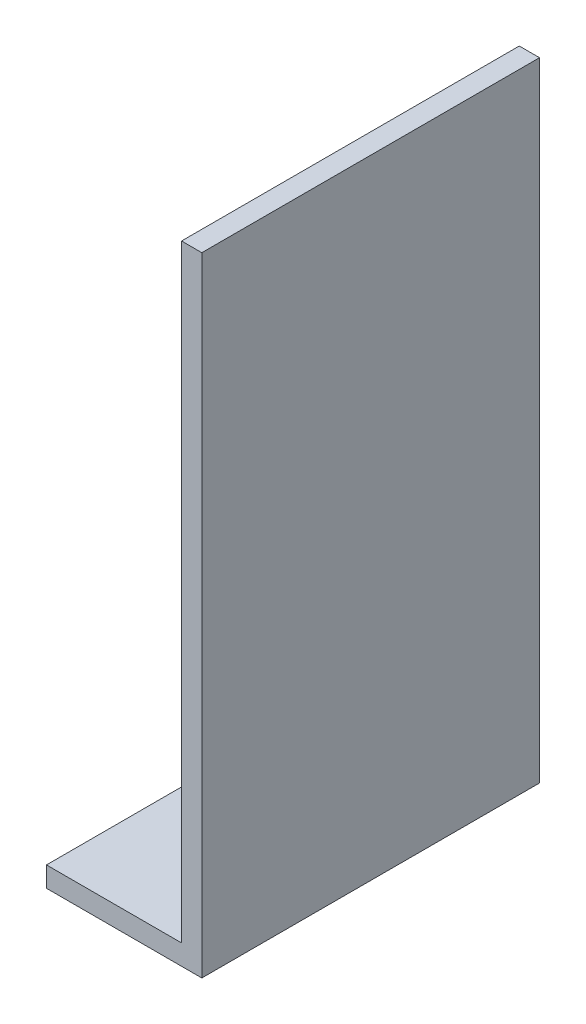
ISO-10303-21;
HEADER;
FILE_DESCRIPTION(('STEP AP214'),'2;1');
FILE_NAME('part.step','',(''),(''),'','','');
FILE_SCHEMA(('AUTOMOTIVE_DESIGN { 1 0 10303 214 1 1 1 1 }'));
ENDSEC;
DATA;
#1=APPLICATION_CONTEXT('core data for automotive mechanical design processes');
#2=APPLICATION_PROTOCOL_DEFINITION('international standard','automotive_design',2000,#1);
#3=PRODUCT_CONTEXT('',#1,'mechanical');
#4=PRODUCT('Part','Part','',(#3));
#5=PRODUCT_RELATED_PRODUCT_CATEGORY('part','',(#4));
#6=PRODUCT_DEFINITION_FORMATION('','',#4);
#7=PRODUCT_DEFINITION_CONTEXT('part definition',#1,'design');
#8=PRODUCT_DEFINITION('design','',#6,#7);
#9=PRODUCT_DEFINITION_SHAPE('','',#8);
#10=(LENGTH_UNIT() NAMED_UNIT(*) SI_UNIT(.MILLI.,.METRE.));
#11=(NAMED_UNIT(*) PLANE_ANGLE_UNIT() SI_UNIT($,.RADIAN.));
#12=(NAMED_UNIT(*) SI_UNIT($,.STERADIAN.) SOLID_ANGLE_UNIT());
#13=UNCERTAINTY_MEASURE_WITH_UNIT(LENGTH_MEASURE(1.E-05),#10,'distance_accuracy_value','');
#14=(GEOMETRIC_REPRESENTATION_CONTEXT(3) GLOBAL_UNCERTAINTY_ASSIGNED_CONTEXT((#13)) GLOBAL_UNIT_ASSIGNED_CONTEXT((#10,
#11,#12)) REPRESENTATION_CONTEXT('',''));
#15=CARTESIAN_POINT('',(0.,0.,0.));
#16=DIRECTION('',(0.,0.,1.));
#17=DIRECTION('',(1.,0.,0.));
#18=AXIS2_PLACEMENT_3D('',#15,#16,#17);
#19=CARTESIAN_POINT('',(0.,3.,0.));
#20=DIRECTION('',(0.,-1.,0.));
#21=DIRECTION('',(0.,0.,-1.));
#22=AXIS2_PLACEMENT_3D('',#19,#20,#21);
#23=PLANE('',#22);
#24=DIRECTION('',(0.,0.,1.));
#25=VECTOR('',#24,1.);
#26=CARTESIAN_POINT('',(20.,3.,0.));
#27=LINE('',#26,#25);
#28=CARTESIAN_POINT('',(20.,3.,-50.));
#29=VERTEX_POINT('',#28);
#30=CARTESIAN_POINT('',(20.,3.,0.));
#31=VERTEX_POINT('',#30);
#32=EDGE_CURVE('E50',#29,#31,#27,.T.);
#33=ORIENTED_EDGE('',*,*,#32,.F.);
#34=DIRECTION('',(-1.,0.,0.));
#35=VECTOR('',#34,1.);
#36=CARTESIAN_POINT('',(0.,3.,-50.));
#37=LINE('',#36,#35);
#38=CARTESIAN_POINT('',(0.,3.,-50.));
#39=VERTEX_POINT('',#38);
#40=EDGE_CURVE('E55',#29,#39,#37,.T.);
#41=ORIENTED_EDGE('',*,*,#40,.T.);
#42=DIRECTION('',(0.,0.,1.));
#43=VECTOR('',#42,1.);
#44=CARTESIAN_POINT('',(0.,3.,0.));
#45=LINE('',#44,#43);
#46=CARTESIAN_POINT('',(0.,3.,0.));
#47=VERTEX_POINT('',#46);
#48=EDGE_CURVE('E86',#39,#47,#45,.T.);
#49=ORIENTED_EDGE('',*,*,#48,.T.);
#50=DIRECTION('',(1.,0.,0.));
#51=VECTOR('',#50,1.);
#52=CARTESIAN_POINT('',(0.,3.,0.));
#53=LINE('',#52,#51);
#54=EDGE_CURVE('E109',#47,#31,#53,.T.);
#55=ORIENTED_EDGE('',*,*,#54,.T.);
#56=EDGE_LOOP('',(#33,#41,#49,#55));
#57=FACE_BOUND('',#56,.T.);
#58=ADVANCED_FACE('F33',(#57),#23,.F.);
#59=CARTESIAN_POINT('',(0.,3.,0.));
#60=DIRECTION('',(1.,0.,0.));
#61=DIRECTION('',(0.,0.,-1.));
#62=AXIS2_PLACEMENT_3D('',#59,#60,#61);
#63=PLANE('',#62);
#64=DIRECTION('',(0.,0.,1.));
#65=VECTOR('',#64,1.);
#66=CARTESIAN_POINT('',(0.,0.,0.));
#67=LINE('',#66,#65);
#68=CARTESIAN_POINT('',(0.,0.,-50.));
#69=VERTEX_POINT('',#68);
#70=CARTESIAN_POINT('',(0.,0.,0.));
#71=VERTEX_POINT('',#70);
#72=EDGE_CURVE('E92',#69,#71,#67,.T.);
#73=ORIENTED_EDGE('',*,*,#72,.T.);
#74=DIRECTION('',(0.,-1.,0.));
#75=VECTOR('',#74,1.);
#76=CARTESIAN_POINT('',(0.,3.,0.));
#77=LINE('',#76,#75);
#78=EDGE_CURVE('E11',#47,#71,#77,.T.);
#79=ORIENTED_EDGE('',*,*,#78,.F.);
#80=ORIENTED_EDGE('',*,*,#48,.F.);
#81=DIRECTION('',(0.,-1.,0.));
#82=VECTOR('',#81,1.);
#83=CARTESIAN_POINT('',(0.,3.,-50.));
#84=LINE('',#83,#82);
#85=EDGE_CURVE('E78',#39,#69,#84,.T.);
#86=ORIENTED_EDGE('',*,*,#85,.T.);
#87=EDGE_LOOP('',(#73,#79,#80,#86));
#88=FACE_BOUND('',#87,.T.);
#89=ADVANCED_FACE('F35',(#88),#63,.F.);
#90=CARTESIAN_POINT('',(0.,3.,0.));
#91=DIRECTION('',(0.,0.,-1.));
#92=DIRECTION('',(-1.,0.,0.));
#93=AXIS2_PLACEMENT_3D('',#90,#91,#92);
#94=PLANE('',#93);
#95=DIRECTION('',(1.,0.,0.));
#96=VECTOR('',#95,1.);
#97=CARTESIAN_POINT('',(0.,0.,0.));
#98=LINE('',#97,#96);
#99=CARTESIAN_POINT('',(23.,0.,0.));
#100=VERTEX_POINT('',#99);
#101=EDGE_CURVE('E95',#71,#100,#98,.T.);
#102=ORIENTED_EDGE('',*,*,#101,.T.);
#103=DIRECTION('',(0.,-1.,0.));
#104=VECTOR('',#103,1.);
#105=CARTESIAN_POINT('',(23.,3.,0.));
#106=LINE('',#105,#104);
#107=CARTESIAN_POINT('',(23.,93.,0.));
#108=VERTEX_POINT('',#107);
#109=EDGE_CURVE('E42',#108,#100,#106,.T.);
#110=ORIENTED_EDGE('',*,*,#109,.F.);
#111=DIRECTION('',(1.,0.,0.));
#112=VECTOR('',#111,1.);
#113=CARTESIAN_POINT('',(23.,93.,0.));
#114=LINE('',#113,#112);
#115=CARTESIAN_POINT('',(20.,93.,0.));
#116=VERTEX_POINT('',#115);
#117=EDGE_CURVE('E117',#116,#108,#114,.T.);
#118=ORIENTED_EDGE('',*,*,#117,.F.);
#119=DIRECTION('',(0.,-1.,0.));
#120=VECTOR('',#119,1.);
#121=CARTESIAN_POINT('',(20.,93.,0.));
#122=LINE('',#121,#120);
#123=EDGE_CURVE('E100',#116,#31,#122,.T.);
#124=ORIENTED_EDGE('',*,*,#123,.T.);
#125=ORIENTED_EDGE('',*,*,#54,.F.);
#126=ORIENTED_EDGE('',*,*,#78,.T.);
#127=EDGE_LOOP('',(#102,#110,#118,#124,#125,#126));
#128=FACE_BOUND('',#127,.T.);
#129=ADVANCED_FACE('F153',(#128),#94,.F.);
#130=CARTESIAN_POINT('',(23.,3.,0.));
#131=DIRECTION('',(-1.,0.,0.));
#132=DIRECTION('',(0.,0.,1.));
#133=AXIS2_PLACEMENT_3D('',#130,#131,#132);
#134=PLANE('',#133);
#135=DIRECTION('',(0.,0.,-1.));
#136=VECTOR('',#135,1.);
#137=CARTESIAN_POINT('',(23.,0.,0.));
#138=LINE('',#137,#136);
#139=CARTESIAN_POINT('',(23.,0.,-50.));
#140=VERTEX_POINT('',#139);
#141=EDGE_CURVE('E87',#100,#140,#138,.T.);
#142=ORIENTED_EDGE('',*,*,#141,.T.);
#143=DIRECTION('',(0.,-1.,0.));
#144=VECTOR('',#143,1.);
#145=CARTESIAN_POINT('',(23.,3.,-50.));
#146=LINE('',#145,#144);
#147=CARTESIAN_POINT('',(23.,93.,-50.));
#148=VERTEX_POINT('',#147);
#149=EDGE_CURVE('E82',#148,#140,#146,.T.);
#150=ORIENTED_EDGE('',*,*,#149,.F.);
#151=DIRECTION('',(0.,0.,-1.));
#152=VECTOR('',#151,1.);
#153=CARTESIAN_POINT('',(23.,93.,0.));
#154=LINE('',#153,#152);
#155=EDGE_CURVE('E120',#108,#148,#154,.T.);
#156=ORIENTED_EDGE('',*,*,#155,.F.);
#157=ORIENTED_EDGE('',*,*,#109,.T.);
#158=EDGE_LOOP('',(#142,#150,#156,#157));
#159=FACE_BOUND('',#158,.T.);
#160=ADVANCED_FACE('F146',(#159),#134,.F.);
#161=CARTESIAN_POINT('',(0.,3.,-50.));
#162=DIRECTION('',(0.,0.,1.));
#163=DIRECTION('',(1.,0.,0.));
#164=AXIS2_PLACEMENT_3D('',#161,#162,#163);
#165=PLANE('',#164);
#166=DIRECTION('',(-1.,0.,0.));
#167=VECTOR('',#166,1.);
#168=CARTESIAN_POINT('',(0.,0.,-50.));
#169=LINE('',#168,#167);
#170=EDGE_CURVE('E75',#140,#69,#169,.T.);
#171=ORIENTED_EDGE('',*,*,#170,.T.);
#172=ORIENTED_EDGE('',*,*,#85,.F.);
#173=ORIENTED_EDGE('',*,*,#40,.F.);
#174=DIRECTION('',(0.,-1.,0.));
#175=VECTOR('',#174,1.);
#176=CARTESIAN_POINT('',(20.,93.,-50.));
#177=LINE('',#176,#175);
#178=CARTESIAN_POINT('',(20.,93.,-50.));
#179=VERTEX_POINT('',#178);
#180=EDGE_CURVE('E96',#179,#29,#177,.T.);
#181=ORIENTED_EDGE('',*,*,#180,.F.);
#182=DIRECTION('',(-1.,0.,0.));
#183=VECTOR('',#182,1.);
#184=CARTESIAN_POINT('',(23.,93.,-50.));
#185=LINE('',#184,#183);
#186=EDGE_CURVE('E134',#148,#179,#185,.T.);
#187=ORIENTED_EDGE('',*,*,#186,.F.);
#188=ORIENTED_EDGE('',*,*,#149,.T.);
#189=EDGE_LOOP('',(#171,#172,#173,#181,#187,#188));
#190=FACE_BOUND('',#189,.T.);
#191=ADVANCED_FACE('F77',(#190),#165,.F.);
#192=CARTESIAN_POINT('',(0.,0.,0.));
#193=DIRECTION('',(0.,-1.,0.));
#194=DIRECTION('',(0.,0.,-1.));
#195=AXIS2_PLACEMENT_3D('',#192,#193,#194);
#196=PLANE('',#195);
#197=ORIENTED_EDGE('',*,*,#72,.F.);
#198=ORIENTED_EDGE('',*,*,#170,.F.);
#199=ORIENTED_EDGE('',*,*,#141,.F.);
#200=ORIENTED_EDGE('',*,*,#101,.F.);
#201=EDGE_LOOP('',(#197,#198,#199,#200));
#202=FACE_BOUND('',#201,.T.);
#203=ADVANCED_FACE('F94',(#202),#196,.T.);
#204=CARTESIAN_POINT('',(20.,93.,0.));
#205=DIRECTION('',(1.,0.,0.));
#206=DIRECTION('',(0.,0.,-1.));
#207=AXIS2_PLACEMENT_3D('',#204,#205,#206);
#208=PLANE('',#207);
#209=ORIENTED_EDGE('',*,*,#32,.T.);
#210=ORIENTED_EDGE('',*,*,#123,.F.);
#211=DIRECTION('',(0.,0.,1.));
#212=VECTOR('',#211,1.);
#213=CARTESIAN_POINT('',(20.,93.,0.));
#214=LINE('',#213,#212);
#215=EDGE_CURVE('E129',#179,#116,#214,.T.);
#216=ORIENTED_EDGE('',*,*,#215,.F.);
#217=ORIENTED_EDGE('',*,*,#180,.T.);
#218=EDGE_LOOP('',(#209,#210,#216,#217));
#219=FACE_BOUND('',#218,.T.);
#220=ADVANCED_FACE('F152',(#219),#208,.F.);
#221=CARTESIAN_POINT('',(0.,93.,0.));
#222=DIRECTION('',(0.,1.,0.));
#223=DIRECTION('',(0.,0.,1.));
#224=AXIS2_PLACEMENT_3D('',#221,#222,#223);
#225=PLANE('',#224);
#226=ORIENTED_EDGE('',*,*,#155,.T.);
#227=ORIENTED_EDGE('',*,*,#186,.T.);
#228=ORIENTED_EDGE('',*,*,#215,.T.);
#229=ORIENTED_EDGE('',*,*,#117,.T.);
#230=EDGE_LOOP('',(#226,#227,#228,#229));
#231=FACE_BOUND('',#230,.T.);
#232=ADVANCED_FACE('F141',(#231),#225,.T.);
#233=CLOSED_SHELL('',(#58,#89,#129,#160,#191,#203,#220,#232));
#234=MANIFOLD_SOLID_BREP('B2',#233);
#235=ADVANCED_BREP_SHAPE_REPRESENTATION('',(#18,#234),#14);
#236=SHAPE_DEFINITION_REPRESENTATION(#9,#235);
ENDSEC;
END-ISO-10303-21;
